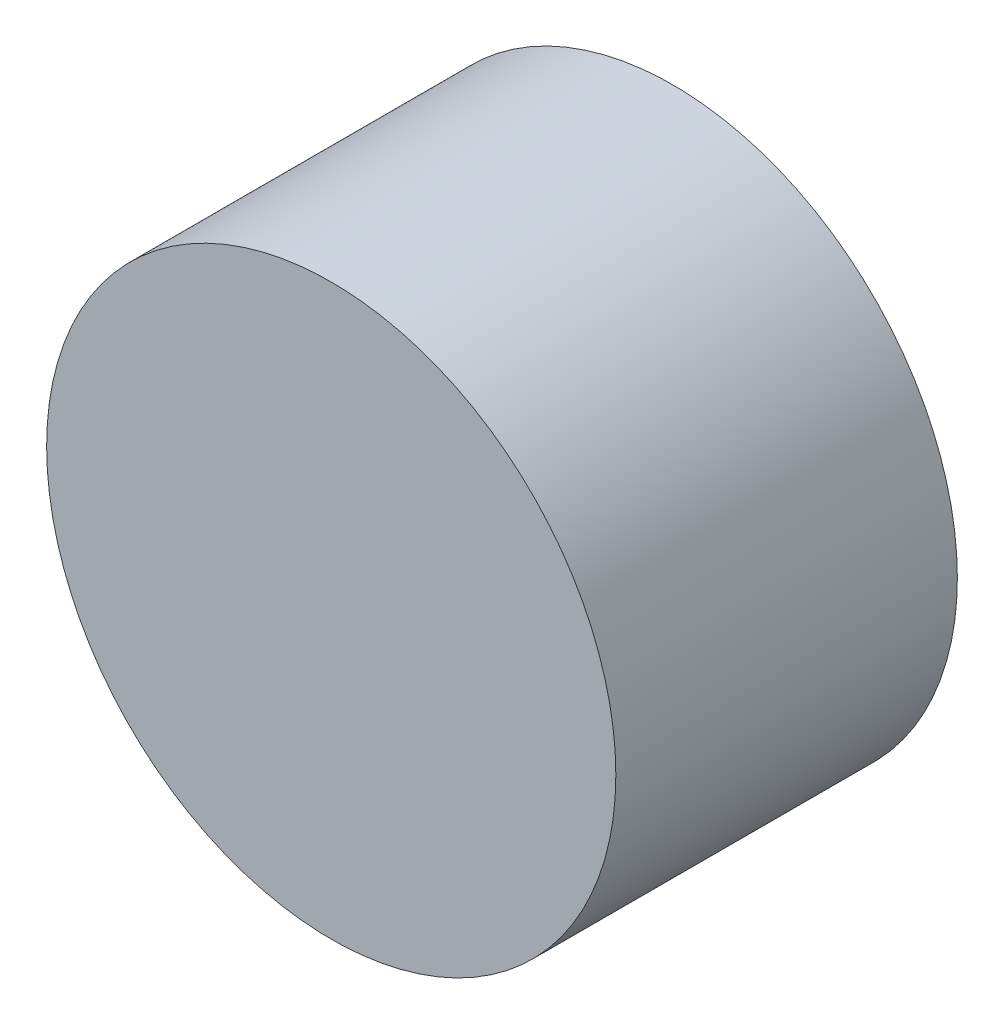
ISO-10303-21;
HEADER;
FILE_DESCRIPTION(('STEP AP214'),'2;1');
FILE_NAME('part.step','',(''),(''),'','','');
FILE_SCHEMA(('AUTOMOTIVE_DESIGN { 1 0 10303 214 1 1 1 1 }'));
ENDSEC;
DATA;
#1=APPLICATION_CONTEXT('core data for automotive mechanical design processes');
#2=APPLICATION_PROTOCOL_DEFINITION('international standard','automotive_design',2000,#1);
#3=PRODUCT_CONTEXT('',#1,'mechanical');
#4=PRODUCT('Part','Part','',(#3));
#5=PRODUCT_RELATED_PRODUCT_CATEGORY('part','',(#4));
#6=PRODUCT_DEFINITION_FORMATION('','',#4);
#7=PRODUCT_DEFINITION_CONTEXT('part definition',#1,'design');
#8=PRODUCT_DEFINITION('design','',#6,#7);
#9=PRODUCT_DEFINITION_SHAPE('','',#8);
#10=(LENGTH_UNIT() NAMED_UNIT(*) SI_UNIT(.MILLI.,.METRE.));
#11=(NAMED_UNIT(*) PLANE_ANGLE_UNIT() SI_UNIT($,.RADIAN.));
#12=(NAMED_UNIT(*) SI_UNIT($,.STERADIAN.) SOLID_ANGLE_UNIT());
#13=UNCERTAINTY_MEASURE_WITH_UNIT(LENGTH_MEASURE(1.E-05),#10,'distance_accuracy_value','');
#14=(GEOMETRIC_REPRESENTATION_CONTEXT(3) GLOBAL_UNCERTAINTY_ASSIGNED_CONTEXT((#13)) GLOBAL_UNIT_ASSIGNED_CONTEXT((#10,
#11,#12)) REPRESENTATION_CONTEXT('',''));
#15=CARTESIAN_POINT('',(0.,0.,0.));
#16=DIRECTION('',(0.,0.,1.));
#17=DIRECTION('',(1.,0.,0.));
#18=AXIS2_PLACEMENT_3D('',#15,#16,#17);
#19=CARTESIAN_POINT('',(0.,0.,12.));
#20=DIRECTION('',(0.,0.,-1.));
#21=DIRECTION('',(-1.,0.,0.));
#22=AXIS2_PLACEMENT_3D('',#19,#20,#21);
#23=CYLINDRICAL_SURFACE('',#22,10.);
#24=CARTESIAN_POINT('',(0.,0.,12.));
#25=DIRECTION('',(0.,0.,1.));
#26=DIRECTION('',(1.,0.,0.));
#27=AXIS2_PLACEMENT_3D('',#24,#25,#26);
#28=CIRCLE('',#27,10.);
#29=CARTESIAN_POINT('',(10.,0.,12.));
#30=VERTEX_POINT('',#29);
#31=EDGE_CURVE('E10',#30,#30,#28,.T.);
#32=ORIENTED_EDGE('',*,*,#31,.F.);
#33=EDGE_LOOP('',(#32));
#34=FACE_BOUND('',#33,.T.);
#35=CARTESIAN_POINT('',(0.,0.,0.));
#36=DIRECTION('',(0.,0.,1.));
#37=DIRECTION('',(1.,0.,0.));
#38=AXIS2_PLACEMENT_3D('',#35,#36,#37);
#39=CIRCLE('',#38,10.);
#40=CARTESIAN_POINT('',(10.,0.,0.));
#41=VERTEX_POINT('',#40);
#42=EDGE_CURVE('E40',#41,#41,#39,.T.);
#43=ORIENTED_EDGE('',*,*,#42,.T.);
#44=EDGE_LOOP('',(#43));
#45=FACE_BOUND('',#44,.T.);
#46=ADVANCED_FACE('F37',(#34,#45),#23,.T.);
#47=CARTESIAN_POINT('',(0.,0.,12.));
#48=DIRECTION('',(0.,0.,1.));
#49=DIRECTION('',(1.,0.,0.));
#50=AXIS2_PLACEMENT_3D('',#47,#48,#49);
#51=PLANE('',#50);
#52=ORIENTED_EDGE('',*,*,#31,.T.);
#53=EDGE_LOOP('',(#52));
#54=FACE_BOUND('',#53,.T.);
#55=ADVANCED_FACE('F54',(#54),#51,.T.);
#56=CARTESIAN_POINT('',(0.,0.,0.));
#57=DIRECTION('',(0.,0.,1.));
#58=DIRECTION('',(1.,0.,0.));
#59=AXIS2_PLACEMENT_3D('',#56,#57,#58);
#60=PLANE('',#59);
#61=ORIENTED_EDGE('',*,*,#42,.F.);
#62=EDGE_LOOP('',(#61));
#63=FACE_BOUND('',#62,.T.);
#64=ADVANCED_FACE('F52',(#63),#60,.F.);
#65=CLOSED_SHELL('',(#46,#55,#64));
#66=MANIFOLD_SOLID_BREP('B2',#65);
#67=ADVANCED_BREP_SHAPE_REPRESENTATION('',(#18,#66),#14);
#68=SHAPE_DEFINITION_REPRESENTATION(#9,#67);
ENDSEC;
END-ISO-10303-21;
